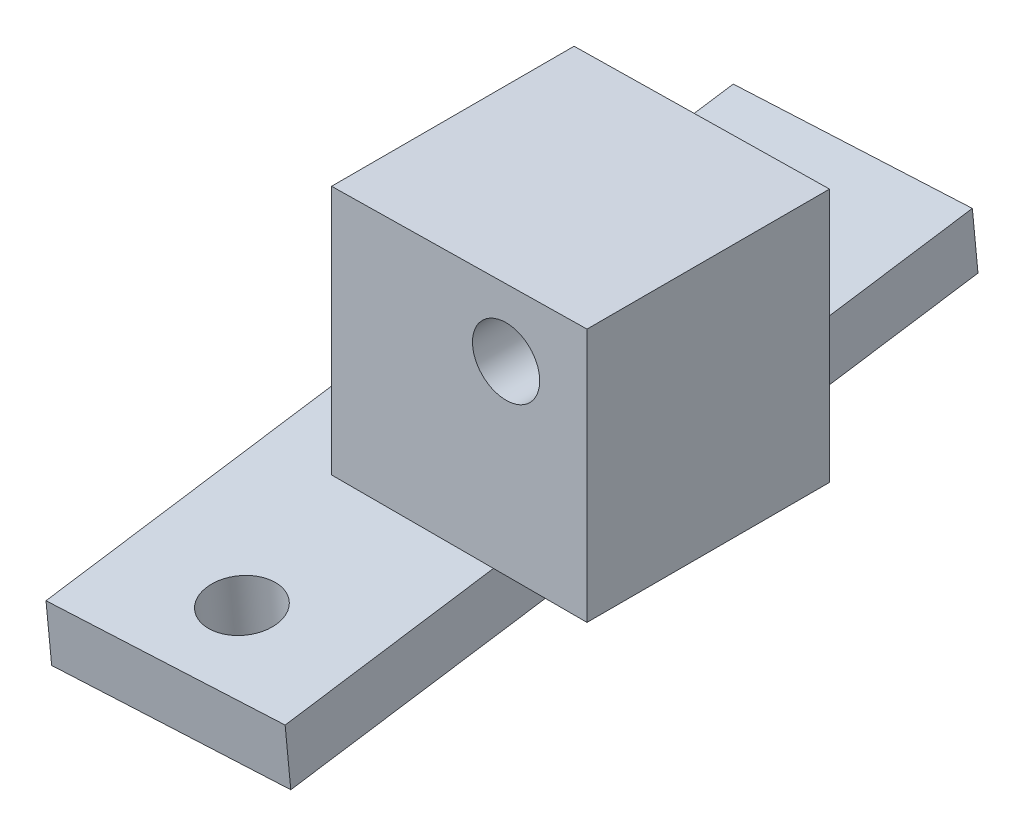
ISO-10303-21;
HEADER;
FILE_DESCRIPTION(('STEP AP214'),'2;1');
FILE_NAME('part.step','',(''),(''),'','','');
FILE_SCHEMA(('AUTOMOTIVE_DESIGN { 1 0 10303 214 1 1 1 1 }'));
ENDSEC;
DATA;
#1=APPLICATION_CONTEXT('core data for automotive mechanical design processes');
#2=APPLICATION_PROTOCOL_DEFINITION('international standard','automotive_design',2000,#1);
#3=PRODUCT_CONTEXT('',#1,'mechanical');
#4=PRODUCT('Part','Part','',(#3));
#5=PRODUCT_RELATED_PRODUCT_CATEGORY('part','',(#4));
#6=PRODUCT_DEFINITION_FORMATION('','',#4);
#7=PRODUCT_DEFINITION_CONTEXT('part definition',#1,'design');
#8=PRODUCT_DEFINITION('design','',#6,#7);
#9=PRODUCT_DEFINITION_SHAPE('','',#8);
#10=(LENGTH_UNIT() NAMED_UNIT(*) SI_UNIT(.MILLI.,.METRE.));
#11=(NAMED_UNIT(*) PLANE_ANGLE_UNIT() SI_UNIT($,.RADIAN.));
#12=(NAMED_UNIT(*) SI_UNIT($,.STERADIAN.) SOLID_ANGLE_UNIT());
#13=UNCERTAINTY_MEASURE_WITH_UNIT(LENGTH_MEASURE(1.E-05),#10,'distance_accuracy_value','');
#14=(GEOMETRIC_REPRESENTATION_CONTEXT(3) GLOBAL_UNCERTAINTY_ASSIGNED_CONTEXT((#13)) GLOBAL_UNIT_ASSIGNED_CONTEXT((#10,
#11,#12)) REPRESENTATION_CONTEXT('',''));
#15=CARTESIAN_POINT('',(0.,0.,0.));
#16=DIRECTION('',(0.,0.,1.));
#17=DIRECTION('',(1.,0.,0.));
#18=AXIS2_PLACEMENT_3D('',#15,#16,#17);
#19=CARTESIAN_POINT('',(0.,0.,0.));
#20=DIRECTION('',(0.,0.,1.));
#21=DIRECTION('',(1.,0.,0.));
#22=AXIS2_PLACEMENT_3D('',#19,#20,#21);
#23=PLANE('',#22);
#24=DIRECTION('',(0.,1.,0.));
#25=VECTOR('',#24,1.);
#26=CARTESIAN_POINT('',(-277.356124968702,241.722821642749,0.));
#27=LINE('',#26,#25);
#28=CARTESIAN_POINT('',(-277.356124968702,240.280672700296,0.));
#29=VERTEX_POINT('',#28);
#30=CARTESIAN_POINT('',(-277.356124968702,264.279078056228,0.));
#31=VERTEX_POINT('',#30);
#32=EDGE_CURVE('E248',#29,#31,#27,.T.);
#33=ORIENTED_EDGE('',*,*,#32,.F.);
#34=DIRECTION('',(-1.,0.,0.));
#35=VECTOR('',#34,1.);
#36=CARTESIAN_POINT('',(-301.486124968702,240.280672700296,0.));
#37=LINE('',#36,#35);
#38=CARTESIAN_POINT('',(-287.312318953133,240.280672700296,0.));
#39=VERTEX_POINT('',#38);
#40=EDGE_CURVE('E167',#29,#39,#37,.T.);
#41=ORIENTED_EDGE('',*,*,#40,.T.);
#42=DIRECTION('',(-0.00455549334561602,0.999989623686355,0.));
#43=VECTOR('',#42,1.);
#44=CARTESIAN_POINT('',(-286.211770850912,-1.30384934669808,0.));
#45=LINE('',#44,#43);
#46=CARTESIAN_POINT('',(-287.322166316557,242.442296150667,0.));
#47=VERTEX_POINT('',#46);
#48=EDGE_CURVE('E76',#39,#47,#45,.T.);
#49=ORIENTED_EDGE('',*,*,#48,.T.);
#50=DIRECTION('',(-1.,0.,0.));
#51=VECTOR('',#50,1.);
#52=CARTESIAN_POINT('',(0.,242.442296150667,0.));
#53=LINE('',#52,#51);
#54=CARTESIAN_POINT('',(-301.486124968702,242.442296150667,0.));
#55=VERTEX_POINT('',#54);
#56=EDGE_CURVE('E225',#47,#55,#53,.T.);
#57=ORIENTED_EDGE('',*,*,#56,.T.);
#58=DIRECTION('',(0.,-1.,0.));
#59=VECTOR('',#58,1.);
#60=CARTESIAN_POINT('',(-301.486124968702,263.900029357395,0.));
#61=LINE('',#60,#59);
#62=CARTESIAN_POINT('',(-301.486124968702,263.900029357395,0.));
#63=VERTEX_POINT('',#62);
#64=EDGE_CURVE('E240',#63,#55,#61,.T.);
#65=ORIENTED_EDGE('',*,*,#64,.F.);
#66=DIRECTION('',(-0.999876642654605,-0.0157066697220126,0.));
#67=VECTOR('',#66,1.);
#68=CARTESIAN_POINT('',(-277.356124968702,264.279078056228,0.));
#69=LINE('',#68,#67);
#70=EDGE_CURVE('E148',#31,#63,#69,.T.);
#71=ORIENTED_EDGE('',*,*,#70,.F.);
#72=EDGE_LOOP('',(#33,#41,#49,#57,#65,#71));
#73=FACE_BOUND('',#72,.T.);
#74=CARTESIAN_POINT('',(-284.999999999996,257.808220007844,0.));
#75=DIRECTION('',(0.,0.,1.));
#76=DIRECTION('',(1.,0.,0.));
#77=AXIS2_PLACEMENT_3D('',#74,#75,#76);
#78=CIRCLE('',#77,3.17499999999758);
#79=CARTESIAN_POINT('',(-281.824999999998,257.808220007844,0.));
#80=VERTEX_POINT('',#79);
#81=EDGE_CURVE('E239',#80,#80,#78,.T.);
#82=ORIENTED_EDGE('',*,*,#81,.T.);
#83=EDGE_LOOP('',(#82));
#84=FACE_BOUND('',#83,.T.);
#85=ADVANCED_FACE('F60',(#73,#84),#23,.F.);
#86=CARTESIAN_POINT('',(-277.356124968702,241.722821642749,56.2017164877576));
#87=DIRECTION('',(-1.,0.,0.));
#88=DIRECTION('',(0.,0.,1.));
#89=AXIS2_PLACEMENT_3D('',#86,#87,#88);
#90=PLANE('',#89);
#91=DIRECTION('',(0.,0.,-1.));
#92=VECTOR('',#91,1.);
#93=CARTESIAN_POINT('',(-277.356124968702,264.279078056228,56.2017164877576));
#94=LINE('',#93,#92);
#95=CARTESIAN_POINT('',(-277.356124968702,264.279078056228,22.9108));
#96=VERTEX_POINT('',#95);
#97=EDGE_CURVE('E247',#96,#31,#94,.T.);
#98=ORIENTED_EDGE('',*,*,#97,.F.);
#99=DIRECTION('',(0.,-1.,0.));
#100=VECTOR('',#99,1.);
#101=CARTESIAN_POINT('',(-277.356124968702,241.722821642749,22.9108));
#102=LINE('',#101,#100);
#103=CARTESIAN_POINT('',(-277.356124968702,240.280672700296,22.9108));
#104=VERTEX_POINT('',#103);
#105=EDGE_CURVE('E252',#96,#104,#102,.T.);
#106=ORIENTED_EDGE('',*,*,#105,.T.);
#107=DIRECTION('',(0.,0.,1.));
#108=VECTOR('',#107,1.);
#109=CARTESIAN_POINT('',(-277.356124968702,240.280672700296,-24.1730571829924));
#110=LINE('',#109,#108);
#111=EDGE_CURVE('E157',#29,#104,#110,.T.);
#112=ORIENTED_EDGE('',*,*,#111,.F.);
#113=ORIENTED_EDGE('',*,*,#32,.T.);
#114=EDGE_LOOP('',(#98,#106,#112,#113));
#115=FACE_BOUND('',#114,.T.);
#116=ADVANCED_FACE('F275',(#115),#90,.F.);
#117=CARTESIAN_POINT('',(-277.356124968702,264.279078056228,56.2017164877576));
#118=DIRECTION('',(0.0157066697220126,-0.999876642654605,0.));
#119=DIRECTION('',(0.999876642654605,0.0157066697220126,0.));
#120=AXIS2_PLACEMENT_3D('',#117,#118,#119);
#121=PLANE('',#120);
#122=DIRECTION('',(0.,0.,-1.));
#123=VECTOR('',#122,1.);
#124=CARTESIAN_POINT('',(-301.486124968702,263.900029357395,56.2017164877576));
#125=LINE('',#124,#123);
#126=CARTESIAN_POINT('',(-301.486124968702,263.900029357395,22.9108));
#127=VERTEX_POINT('',#126);
#128=EDGE_CURVE('E147',#127,#63,#125,.T.);
#129=ORIENTED_EDGE('',*,*,#128,.F.);
#130=DIRECTION('',(0.999876642654605,0.0157066697220126,0.));
#131=VECTOR('',#130,1.);
#132=CARTESIAN_POINT('',(-277.356124968702,264.279078056228,22.9108));
#133=LINE('',#132,#131);
#134=EDGE_CURVE('E143',#127,#96,#133,.T.);
#135=ORIENTED_EDGE('',*,*,#134,.T.);
#136=ORIENTED_EDGE('',*,*,#97,.T.);
#137=ORIENTED_EDGE('',*,*,#70,.T.);
#138=EDGE_LOOP('',(#129,#135,#136,#137));
#139=FACE_BOUND('',#138,.T.);
#140=ADVANCED_FACE('F277',(#139),#121,.F.);
#141=CARTESIAN_POINT('',(-301.486124968702,263.900029357395,56.2017164877576));
#142=DIRECTION('',(1.,0.,0.));
#143=DIRECTION('',(0.,0.,-1.));
#144=AXIS2_PLACEMENT_3D('',#141,#142,#143);
#145=PLANE('',#144);
#146=ORIENTED_EDGE('',*,*,#64,.T.);
#147=DIRECTION('',(0.,-0.09545775621834,0.995433481844849));
#148=VECTOR('',#147,1.);
#149=CARTESIAN_POINT('',(-301.486124968702,237.297432062091,53.6506427156725));
#150=LINE('',#149,#148);
#151=CARTESIAN_POINT('',(-301.486124968702,240.280672700296,22.5414093404734));
#152=VERTEX_POINT('',#151);
#153=EDGE_CURVE('E69',#55,#152,#150,.T.);
#154=ORIENTED_EDGE('',*,*,#153,.T.);
#155=DIRECTION('',(0.,0.,1.));
#156=VECTOR('',#155,1.);
#157=CARTESIAN_POINT('',(-301.486124968702,240.280672700296,-24.1730571829924));
#158=LINE('',#157,#156);
#159=CARTESIAN_POINT('',(-301.486124968702,240.280672700296,22.9108));
#160=VERTEX_POINT('',#159);
#161=EDGE_CURVE('E151',#152,#160,#158,.T.);
#162=ORIENTED_EDGE('',*,*,#161,.T.);
#163=DIRECTION('',(0.,1.,0.));
#164=VECTOR('',#163,1.);
#165=CARTESIAN_POINT('',(-301.486124968702,263.900029357395,22.9108));
#166=LINE('',#165,#164);
#167=EDGE_CURVE('E138',#160,#127,#166,.T.);
#168=ORIENTED_EDGE('',*,*,#167,.T.);
#169=ORIENTED_EDGE('',*,*,#128,.T.);
#170=EDGE_LOOP('',(#146,#154,#162,#168,#169));
#171=FACE_BOUND('',#170,.T.);
#172=ADVANCED_FACE('F153',(#171),#145,.F.);
#173=CARTESIAN_POINT('',(-284.999999999996,257.808220007844,56.2017164877576));
#174=DIRECTION('',(0.,0.,-1.));
#175=DIRECTION('',(-1.,0.,0.));
#176=AXIS2_PLACEMENT_3D('',#173,#174,#175);
#177=CYLINDRICAL_SURFACE('',#176,3.17499999999758);
#178=CARTESIAN_POINT('',(-284.999999999996,257.808220007844,22.9108));
#179=DIRECTION('',(0.,0.,-1.));
#180=DIRECTION('',(0.,1.,0.));
#181=AXIS2_PLACEMENT_3D('',#178,#179,#180);
#182=CIRCLE('',#181,3.17499999999758);
#183=CARTESIAN_POINT('',(-284.999999999996,260.983220007842,22.9108));
#184=VERTEX_POINT('',#183);
#185=EDGE_CURVE('E243',#184,#184,#182,.T.);
#186=ORIENTED_EDGE('',*,*,#185,.F.);
#187=EDGE_LOOP('',(#186));
#188=FACE_BOUND('',#187,.T.);
#189=ORIENTED_EDGE('',*,*,#81,.F.);
#190=EDGE_LOOP('',(#189));
#191=FACE_BOUND('',#190,.T.);
#192=ADVANCED_FACE('F323',(#188,#191),#177,.F.);
#193=CARTESIAN_POINT('',(-259.570136956663,305.935789375131,22.9108));
#194=DIRECTION('',(0.,0.,-1.));
#195=DIRECTION('',(0.,1.,0.));
#196=AXIS2_PLACEMENT_3D('',#193,#194,#195);
#197=PLANE('',#196);
#198=ORIENTED_EDGE('',*,*,#185,.T.);
#199=EDGE_LOOP('',(#198));
#200=FACE_BOUND('',#199,.T.);
#201=ORIENTED_EDGE('',*,*,#105,.F.);
#202=ORIENTED_EDGE('',*,*,#134,.F.);
#203=ORIENTED_EDGE('',*,*,#167,.F.);
#204=DIRECTION('',(1.,0.,0.));
#205=VECTOR('',#204,1.);
#206=CARTESIAN_POINT('',(-301.486124968702,240.280672700296,22.9108));
#207=LINE('',#206,#205);
#208=EDGE_CURVE('E141',#160,#104,#207,.T.);
#209=ORIENTED_EDGE('',*,*,#208,.T.);
#210=EDGE_LOOP('',(#201,#202,#203,#209));
#211=FACE_BOUND('',#210,.T.);
#212=ADVANCED_FACE('F62',(#200,#211),#197,.F.);
#213=CARTESIAN_POINT('',(-285.234279332924,232.703534824107,43.0168197832102));
#214=DIRECTION('',(0.998863194012666,0.00455036184948722,-0.0474511733664593));
#215=DIRECTION('',(-0.0474516646311741,0.,-0.998873535300506));
#216=AXIS2_PLACEMENT_3D('',#213,#214,#215);
#217=PLANE('',#216);
#218=DIRECTION('',(-0.0474516646311741,0.,-0.998873535300506));
#219=VECTOR('',#218,1.);
#220=CARTESIAN_POINT('',(-285.268719569542,240.280672700296,43.0184558727652));
#221=LINE('',#220,#219);
#222=CARTESIAN_POINT('',(-286.241485300486,240.280672700296,22.5414093404744));
#223=VERTEX_POINT('',#222);
#224=EDGE_CURVE('E80',#223,#39,#221,.T.);
#225=ORIENTED_EDGE('',*,*,#224,.F.);
#226=DIRECTION('',(-0.0476688540539317,0.0953492392695335,-0.994301867102695));
#227=VECTOR('',#226,1.);
#228=CARTESIAN_POINT('',(-285.234279332924,238.266017120656,43.5502377249583));
#229=LINE('',#228,#227);
#230=CARTESIAN_POINT('',(-285.234279332924,238.266017120656,43.5502377249583));
#231=VERTEX_POINT('',#230);
#232=EDGE_CURVE('E194',#231,#223,#229,.T.);
#233=ORIENTED_EDGE('',*,*,#232,.F.);
#234=DIRECTION('',(0.,0.995433481844849,0.0954577562183399));
#235=VECTOR('',#234,1.);
#236=CARTESIAN_POINT('',(-285.234279332924,232.703534824107,43.0168197832102));
#237=LINE('',#236,#235);
#238=CARTESIAN_POINT('',(-285.234279332924,232.703534824107,43.0168197832102));
#239=VERTEX_POINT('',#238);
#240=EDGE_CURVE('E226',#239,#231,#237,.T.);
#241=ORIENTED_EDGE('',*,*,#240,.F.);
#242=DIRECTION('',(-0.0476688540539317,0.0953492392695335,-0.994301867102695));
#243=VECTOR('',#242,1.);
#244=CARTESIAN_POINT('',(-285.234279332924,232.703534824107,43.0168197832102));
#245=LINE('',#244,#243);
#246=CARTESIAN_POINT('',(-288.503409343943,239.242585653211,-25.1724022626926));
#247=VERTEX_POINT('',#246);
#248=EDGE_CURVE('E202',#239,#247,#245,.T.);
#249=ORIENTED_EDGE('',*,*,#248,.T.);
#250=DIRECTION('',(0.,0.995433481844849,0.0954577562183399));
#251=VECTOR('',#250,1.);
#252=CARTESIAN_POINT('',(-288.503409343943,239.242585653211,-25.1724022626926));
#253=LINE('',#252,#251);
#254=CARTESIAN_POINT('',(-288.503409343943,244.80506794976,-24.6389843209446));
#255=VERTEX_POINT('',#254);
#256=EDGE_CURVE('E221',#247,#255,#253,.T.);
#257=ORIENTED_EDGE('',*,*,#256,.T.);
#258=EDGE_CURVE('E218',#47,#255,#229,.T.);
#259=ORIENTED_EDGE('',*,*,#258,.F.);
#260=ORIENTED_EDGE('',*,*,#48,.F.);
#261=EDGE_LOOP('',(#225,#233,#241,#249,#257,#259,#260));
#262=FACE_BOUND('',#261,.T.);
#263=ADVANCED_FACE('F282',(#262),#217,.T.);
#264=CARTESIAN_POINT('',(0.,240.233117527322,23.0373146842464));
#265=DIRECTION('',(0.,0.995433481844849,0.09545775621834));
#266=DIRECTION('',(0.,-0.09545775621834,0.995433481844849));
#267=AXIS2_PLACEMENT_3D('',#264,#265,#266);
#268=PLANE('',#267);
#269=DIRECTION('',(1.,0.,0.));
#270=VECTOR('',#269,1.);
#271=CARTESIAN_POINT('',(0.,240.280672700296,22.5414093404735));
#272=LINE('',#271,#270);
#273=EDGE_CURVE('E12',#152,#223,#272,.T.);
#274=ORIENTED_EDGE('',*,*,#273,.F.);
#275=ORIENTED_EDGE('',*,*,#153,.F.);
#276=ORIENTED_EDGE('',*,*,#56,.F.);
#277=ORIENTED_EDGE('',*,*,#258,.T.);
#278=DIRECTION('',(-0.998863194012666,-0.00455036184948762,0.0474511733664599));
#279=VECTOR('',#278,1.);
#280=CARTESIAN_POINT('',(-288.503409343943,244.80506794976,-24.6389843209446));
#281=LINE('',#280,#279);
#282=CARTESIAN_POINT('',(-310.068865702676,244.70682563743,-23.6145134879627));
#283=VERTEX_POINT('',#282);
#284=EDGE_CURVE('E185',#255,#283,#281,.T.);
#285=ORIENTED_EDGE('',*,*,#284,.T.);
#286=DIRECTION('',(0.0476688540539318,-0.0953492392695335,0.994301867102696));
#287=VECTOR('',#286,1.);
#288=CARTESIAN_POINT('',(-310.068865702676,244.70682563743,-23.6145134879627));
#289=LINE('',#288,#287);
#290=CARTESIAN_POINT('',(-306.799735691658,238.167774808325,44.5747085579402));
#291=VERTEX_POINT('',#290);
#292=EDGE_CURVE('E210',#283,#291,#289,.T.);
#293=ORIENTED_EDGE('',*,*,#292,.T.);
#294=DIRECTION('',(0.998863194012666,0.00455036184948762,-0.047451173366459));
#295=VECTOR('',#294,1.);
#296=CARTESIAN_POINT('',(-306.799735691658,238.167774808325,44.5747085579402));
#297=LINE('',#296,#295);
#298=EDGE_CURVE('E214',#291,#231,#297,.T.);
#299=ORIENTED_EDGE('',*,*,#298,.T.);
#300=ORIENTED_EDGE('',*,*,#232,.T.);
#301=EDGE_LOOP('',(#274,#275,#276,#277,#285,#293,#299,#300));
#302=FACE_BOUND('',#301,.T.);
#303=CARTESIAN_POINT('',(-298.922900855419,244.029385590361,-16.5501686771311));
#304=DIRECTION('',(0.,0.995433481844849,0.0954577562183399));
#305=DIRECTION('',(0.,-0.0954577562183399,0.995433481844849));
#306=AXIS2_PLACEMENT_3D('',#303,#304,#305);
#307=CIRCLE('',#306,3.17499999999997);
#308=CARTESIAN_POINT('',(-298.922900855419,243.726307214368,-13.3896673722737));
#309=VERTEX_POINT('',#308);
#310=EDGE_CURVE('E177',#309,#309,#307,.T.);
#311=ORIENTED_EDGE('',*,*,#310,.F.);
#312=EDGE_LOOP('',(#311));
#313=FACE_BOUND('',#312,.T.);
#314=CARTESIAN_POINT('',(-296.380244180182,238.943457167724,36.4858929141267));
#315=DIRECTION('',(0.,0.995433481844849,0.0954577562183399));
#316=DIRECTION('',(0.,-0.0954577562183399,0.995433481844849));
#317=AXIS2_PLACEMENT_3D('',#314,#315,#316);
#318=CIRCLE('',#317,3.17499999999997);
#319=CARTESIAN_POINT('',(-296.380244180182,238.640378791731,39.6463942189841));
#320=VERTEX_POINT('',#319);
#321=EDGE_CURVE('E172',#320,#320,#318,.T.);
#322=ORIENTED_EDGE('',*,*,#321,.F.);
#323=EDGE_LOOP('',(#322));
#324=FACE_BOUND('',#323,.T.);
#325=ADVANCED_FACE('F280',(#302,#313,#324),#268,.T.);
#326=CARTESIAN_POINT('',(-288.503409343943,239.242585653211,-25.1724022626926));
#327=DIRECTION('',(-0.0476688540539324,0.0953492392695335,-0.994301867102695));
#328=DIRECTION('',(0.,0.995433481844849,0.0954577562183399));
#329=AXIS2_PLACEMENT_3D('',#326,#327,#328);
#330=PLANE('',#329);
#331=ORIENTED_EDGE('',*,*,#284,.F.);
#332=ORIENTED_EDGE('',*,*,#256,.F.);
#333=DIRECTION('',(-0.998863194012666,-0.00455036184948762,0.0474511733664599));
#334=VECTOR('',#333,1.);
#335=CARTESIAN_POINT('',(-288.503409343943,239.242585653211,-25.1724022626926));
#336=LINE('',#335,#334);
#337=CARTESIAN_POINT('',(-310.068865702676,239.144343340881,-24.1479314297108));
#338=VERTEX_POINT('',#337);
#339=EDGE_CURVE('E189',#247,#338,#336,.T.);
#340=ORIENTED_EDGE('',*,*,#339,.T.);
#341=DIRECTION('',(0.,0.995433481844849,0.0954577562183399));
#342=VECTOR('',#341,1.);
#343=CARTESIAN_POINT('',(-310.068865702676,239.144343340881,-24.1479314297108));
#344=LINE('',#343,#342);
#345=EDGE_CURVE('E206',#338,#283,#344,.T.);
#346=ORIENTED_EDGE('',*,*,#345,.T.);
#347=EDGE_LOOP('',(#331,#332,#340,#346));
#348=FACE_BOUND('',#347,.T.);
#349=ADVANCED_FACE('F287',(#348),#330,.T.);
#350=CARTESIAN_POINT('',(-306.799735691658,232.605292511776,44.0412906161921));
#351=DIRECTION('',(0.0476688540539315,-0.0953492392695335,0.994301867102696));
#352=DIRECTION('',(0.,-0.995433481844849,-0.0954577562183399));
#353=AXIS2_PLACEMENT_3D('',#350,#351,#352);
#354=PLANE('',#353);
#355=ORIENTED_EDGE('',*,*,#298,.F.);
#356=DIRECTION('',(0.,0.995433481844849,0.0954577562183399));
#357=VECTOR('',#356,1.);
#358=CARTESIAN_POINT('',(-306.799735691658,232.605292511776,44.0412906161921));
#359=LINE('',#358,#357);
#360=CARTESIAN_POINT('',(-306.799735691658,232.605292511776,44.0412906161921));
#361=VERTEX_POINT('',#360);
#362=EDGE_CURVE('E229',#361,#291,#359,.T.);
#363=ORIENTED_EDGE('',*,*,#362,.F.);
#364=DIRECTION('',(0.998863194012666,0.00455036184948762,-0.047451173366459));
#365=VECTOR('',#364,1.);
#366=CARTESIAN_POINT('',(-306.799735691658,232.605292511776,44.0412906161921));
#367=LINE('',#366,#365);
#368=EDGE_CURVE('E198',#361,#239,#367,.T.);
#369=ORIENTED_EDGE('',*,*,#368,.T.);
#370=ORIENTED_EDGE('',*,*,#240,.T.);
#371=EDGE_LOOP('',(#355,#363,#369,#370));
#372=FACE_BOUND('',#371,.T.);
#373=ADVANCED_FACE('F295',(#372),#354,.T.);
#374=CARTESIAN_POINT('',(-310.068865702676,239.144343340881,-24.1479314297108));
#375=DIRECTION('',(-0.998863194012666,-0.00455036184948722,0.0474511733664593));
#376=DIRECTION('',(0.0474516646311741,0.,0.998873535300506));
#377=AXIS2_PLACEMENT_3D('',#374,#375,#376);
#378=PLANE('',#377);
#379=ORIENTED_EDGE('',*,*,#292,.F.);
#380=ORIENTED_EDGE('',*,*,#345,.F.);
#381=DIRECTION('',(0.0476688540539318,-0.0953492392695335,0.994301867102696));
#382=VECTOR('',#381,1.);
#383=CARTESIAN_POINT('',(-310.068865702676,239.144343340881,-24.1479314297108));
#384=LINE('',#383,#382);
#385=EDGE_CURVE('E193',#338,#361,#384,.T.);
#386=ORIENTED_EDGE('',*,*,#385,.T.);
#387=ORIENTED_EDGE('',*,*,#362,.T.);
#388=EDGE_LOOP('',(#379,#380,#386,#387));
#389=FACE_BOUND('',#388,.T.);
#390=ADVANCED_FACE('F291',(#389),#378,.T.);
#391=CARTESIAN_POINT('',(0.,234.670635230773,22.5038967424983));
#392=DIRECTION('',(0.,0.995433481844849,0.09545775621834));
#393=DIRECTION('',(0.,-0.09545775621834,0.995433481844849));
#394=AXIS2_PLACEMENT_3D('',#391,#392,#393);
#395=PLANE('',#394);
#396=CARTESIAN_POINT('',(-296.380244180182,233.380974871175,35.9524749723786));
#397=DIRECTION('',(0.,0.995433481844849,0.0954577562183399));
#398=DIRECTION('',(0.,-0.0954577562183399,0.995433481844849));
#399=AXIS2_PLACEMENT_3D('',#396,#397,#398);
#400=CIRCLE('',#399,3.17499999999997);
#401=CARTESIAN_POINT('',(-296.380244180182,233.077896495182,39.112976277236));
#402=VERTEX_POINT('',#401);
#403=EDGE_CURVE('E173',#402,#402,#400,.T.);
#404=ORIENTED_EDGE('',*,*,#403,.T.);
#405=EDGE_LOOP('',(#404));
#406=FACE_BOUND('',#405,.T.);
#407=CARTESIAN_POINT('',(-298.922900855419,238.466903293812,-17.0835866188792));
#408=DIRECTION('',(0.,0.995433481844849,0.0954577562183399));
#409=DIRECTION('',(0.,-0.0954577562183399,0.995433481844849));
#410=AXIS2_PLACEMENT_3D('',#407,#408,#409);
#411=CIRCLE('',#410,3.17499999999997);
#412=CARTESIAN_POINT('',(-298.922900855419,238.163824917819,-13.9230853140218));
#413=VERTEX_POINT('',#412);
#414=EDGE_CURVE('E181',#413,#413,#411,.T.);
#415=ORIENTED_EDGE('',*,*,#414,.T.);
#416=EDGE_LOOP('',(#415));
#417=FACE_BOUND('',#416,.T.);
#418=ORIENTED_EDGE('',*,*,#339,.F.);
#419=ORIENTED_EDGE('',*,*,#248,.F.);
#420=ORIENTED_EDGE('',*,*,#368,.F.);
#421=ORIENTED_EDGE('',*,*,#385,.F.);
#422=EDGE_LOOP('',(#418,#419,#420,#421));
#423=FACE_BOUND('',#422,.T.);
#424=ADVANCED_FACE('F297',(#406,#417,#423),#395,.F.);
#425=CARTESIAN_POINT('',(-298.922900855419,238.466903293812,-17.0835866188792));
#426=DIRECTION('',(0.,0.995433481844849,0.0954577562183399));
#427=DIRECTION('',(0.,-0.0954577562183399,0.995433481844849));
#428=AXIS2_PLACEMENT_3D('',#425,#426,#427);
#429=CYLINDRICAL_SURFACE('',#428,3.17499999999997);
#430=ORIENTED_EDGE('',*,*,#414,.F.);
#431=EDGE_LOOP('',(#430));
#432=FACE_BOUND('',#431,.T.);
#433=ORIENTED_EDGE('',*,*,#310,.T.);
#434=EDGE_LOOP('',(#433));
#435=FACE_BOUND('',#434,.T.);
#436=ADVANCED_FACE('F299',(#432,#435),#429,.F.);
#437=CARTESIAN_POINT('',(-296.380244180182,233.380974871175,35.9524749723786));
#438=DIRECTION('',(0.,0.995433481844849,0.0954577562183399));
#439=DIRECTION('',(0.,-0.0954577562183399,0.995433481844849));
#440=AXIS2_PLACEMENT_3D('',#437,#438,#439);
#441=CYLINDRICAL_SURFACE('',#440,3.17499999999997);
#442=ORIENTED_EDGE('',*,*,#403,.F.);
#443=EDGE_LOOP('',(#442));
#444=FACE_BOUND('',#443,.T.);
#445=ORIENTED_EDGE('',*,*,#321,.T.);
#446=EDGE_LOOP('',(#445));
#447=FACE_BOUND('',#446,.T.);
#448=ADVANCED_FACE('F306',(#444,#447),#441,.F.);
#449=CARTESIAN_POINT('',(-301.486124968702,240.280672700296,-24.1730571829924));
#450=DIRECTION('',(0.,-1.,0.));
#451=DIRECTION('',(0.,0.,-1.));
#452=AXIS2_PLACEMENT_3D('',#449,#450,#451);
#453=PLANE('',#452);
#454=ORIENTED_EDGE('',*,*,#273,.T.);
#455=ORIENTED_EDGE('',*,*,#224,.T.);
#456=ORIENTED_EDGE('',*,*,#40,.F.);
#457=ORIENTED_EDGE('',*,*,#111,.T.);
#458=ORIENTED_EDGE('',*,*,#208,.F.);
#459=ORIENTED_EDGE('',*,*,#161,.F.);
#460=EDGE_LOOP('',(#454,#455,#456,#457,#458,#459));
#461=FACE_BOUND('',#460,.T.);
#462=ADVANCED_FACE('F160',(#461),#453,.T.);
#463=CLOSED_SHELL('',(#85,#116,#140,#172,#192,#212,#263,#325,#349,#373,#390,#424,#436,#448,#462));
#464=MANIFOLD_SOLID_BREP('B2',#463);
#465=ADVANCED_BREP_SHAPE_REPRESENTATION('',(#18,#464),#14);
#466=SHAPE_DEFINITION_REPRESENTATION(#9,#465);
ENDSEC;
END-ISO-10303-21;
